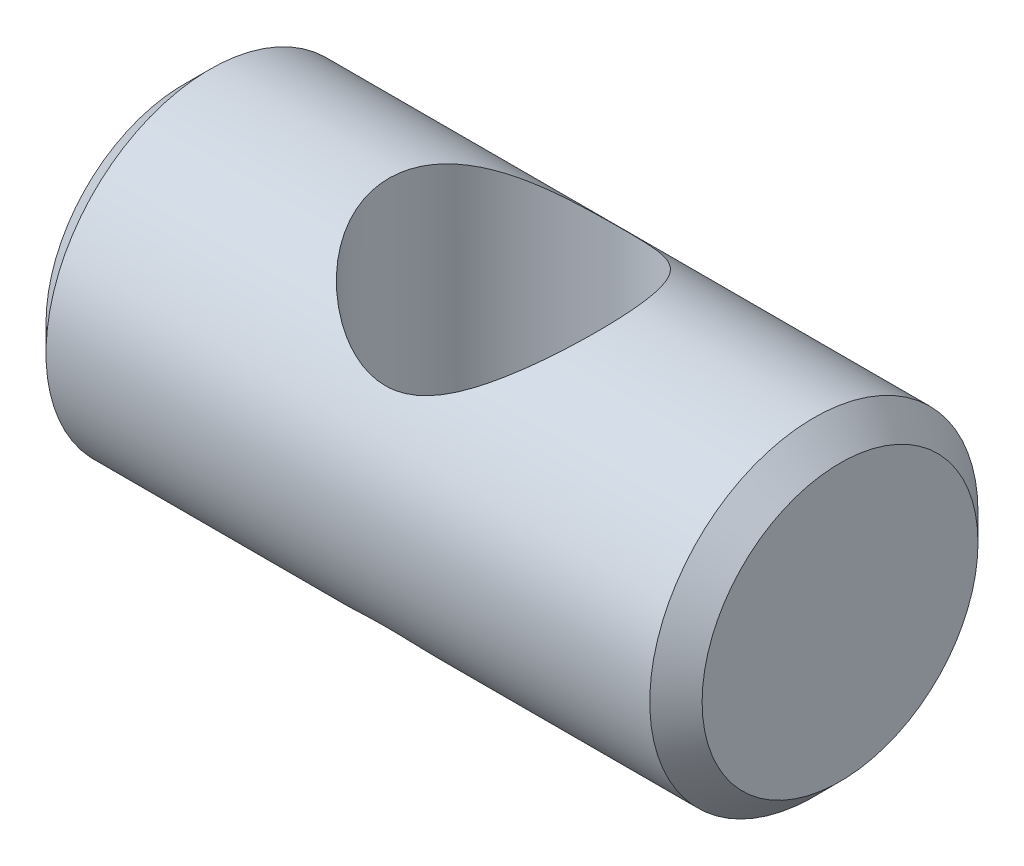
ISO-10303-21;
HEADER;
FILE_DESCRIPTION(('STEP AP214'),'2;1');
FILE_NAME('part.step','',(''),(''),'','','');
FILE_SCHEMA(('AUTOMOTIVE_DESIGN { 1 0 10303 214 1 1 1 1 }'));
ENDSEC;
DATA;
#1=APPLICATION_CONTEXT('core data for automotive mechanical design processes');
#2=APPLICATION_PROTOCOL_DEFINITION('international standard','automotive_design',2000,#1);
#3=PRODUCT_CONTEXT('',#1,'mechanical');
#4=PRODUCT('Part','Part','',(#3));
#5=PRODUCT_RELATED_PRODUCT_CATEGORY('part','',(#4));
#6=PRODUCT_DEFINITION_FORMATION('','',#4);
#7=PRODUCT_DEFINITION_CONTEXT('part definition',#1,'design');
#8=PRODUCT_DEFINITION('design','',#6,#7);
#9=PRODUCT_DEFINITION_SHAPE('','',#8);
#10=(LENGTH_UNIT() NAMED_UNIT(*) SI_UNIT(.MILLI.,.METRE.));
#11=(NAMED_UNIT(*) PLANE_ANGLE_UNIT() SI_UNIT($,.RADIAN.));
#12=(NAMED_UNIT(*) SI_UNIT($,.STERADIAN.) SOLID_ANGLE_UNIT());
#13=UNCERTAINTY_MEASURE_WITH_UNIT(LENGTH_MEASURE(1.E-05),#10,'distance_accuracy_value','');
#14=(GEOMETRIC_REPRESENTATION_CONTEXT(3) GLOBAL_UNCERTAINTY_ASSIGNED_CONTEXT((#13)) GLOBAL_UNIT_ASSIGNED_CONTEXT((#10,
#11,#12)) REPRESENTATION_CONTEXT('',''));
#15=CARTESIAN_POINT('',(0.,0.,0.));
#16=DIRECTION('',(0.,0.,1.));
#17=DIRECTION('',(1.,0.,0.));
#18=AXIS2_PLACEMENT_3D('',#15,#16,#17);
#19=CARTESIAN_POINT('',(9.525,0.,0.));
#20=DIRECTION('',(-1.,0.,0.));
#21=DIRECTION('',(0.,0.,1.));
#22=AXIS2_PLACEMENT_3D('',#19,#20,#21);
#23=CYLINDRICAL_SURFACE('',#22,4.765);
#24=CARTESIAN_POINT('',(0.,-3.0270158572429,3.68));
#25=CARTESIAN_POINT('',(0.0785672773316465,-3.02701614791727,3.67999984364138));
#26=CARTESIAN_POINT('',(0.157136135576355,-3.03031605642996,3.67729277636747));
#27=CARTESIAN_POINT('',(0.313369541449519,-3.04330147157753,3.66655295600809));
#28=CARTESIAN_POINT('',(0.391034010912772,-3.05298752605126,3.65851974601636));
#29=CARTESIAN_POINT('',(0.544942339151606,-3.07820352988238,3.63732812874269));
#30=CARTESIAN_POINT('',(0.621180877977561,-3.09375201630091,3.62415345944192));
#31=CARTESIAN_POINT('',(0.771468880528867,-3.12988210454059,3.59299821855179));
#32=CARTESIAN_POINT('',(0.845516665983407,-3.15046745848851,3.57501406328682));
#33=CARTESIAN_POINT('',(1.09433047382612,-3.22791462831319,3.50587087765695));
#34=CARTESIAN_POINT('',(1.26309282362243,-3.29483865802861,3.44382003292069));
#35=CARTESIAN_POINT('',(1.50370711041474,-3.40467601246938,3.33408533723918));
#36=CARTESIAN_POINT('',(1.58189244838754,-3.44290479326836,3.29468500807197));
#37=CARTESIAN_POINT('',(1.73423285237257,-3.52148653298939,3.21055545325705));
#38=CARTESIAN_POINT('',(1.80838881793449,-3.56183901380659,3.16582742418489));
#39=CARTESIAN_POINT('',(2.02850482582812,-3.68672600847629,3.02153691887044));
#40=CARTESIAN_POINT('',(2.16807869449588,-3.77315168849593,2.9137218740972));
#41=CARTESIAN_POINT('',(2.42959010373284,-3.94426933228633,2.67754924945123));
#42=CARTESIAN_POINT('',(2.55153658554773,-4.02896215617591,2.54920215427041));
#43=CARTESIAN_POINT('',(2.77693730786715,-4.19195052141121,2.27132648174837));
#44=CARTESIAN_POINT('',(2.88023478105728,-4.27018907543985,2.12163570850646));
#45=CARTESIAN_POINT('',(3.06369900830999,-4.41409842691617,1.80316374111448));
#46=CARTESIAN_POINT('',(3.14388622560065,-4.47978032533083,1.63439962117957));
#47=CARTESIAN_POINT('',(3.26635689009236,-4.58439476517905,1.30881127520956));
#48=CARTESIAN_POINT('',(3.3126324755552,-4.62591646772975,1.15433056577145));
#49=CARTESIAN_POINT('',(3.38325654959983,-4.69367027218436,0.837202280830251));
#50=CARTESIAN_POINT('',(3.40762001451853,-4.7199128126465,0.674560363681938));
#51=CARTESIAN_POINT('',(3.43267527752513,-4.75538994748078,0.345016918949482));
#52=CARTESIAN_POINT('',(3.43328564995364,-4.76456593536209,0.178102701594282));
#53=CARTESIAN_POINT('',(3.41018166140548,-4.76540378920208,-0.15408080850447));
#54=CARTESIAN_POINT('',(3.38646547727926,-4.75706434242047,-0.319349977022776));
#55=CARTESIAN_POINT('',(3.31775156953333,-4.72510260499364,-0.634317782486349));
#56=CARTESIAN_POINT('',(3.27397352746067,-4.70233080305011,-0.784375176401481));
#57=CARTESIAN_POINT('',(3.16750864597913,-4.64450941494238,-1.07505429218325));
#58=CARTESIAN_POINT('',(3.10481828431147,-4.60945754152293,-1.21567425043884));
#59=CARTESIAN_POINT('',(2.95652856255593,-4.52638674091888,-1.49677788855974));
#60=CARTESIAN_POINT('',(2.86942133720827,-4.47751111873768,-1.63620711351602));
#61=CARTESIAN_POINT('',(2.67788120319372,-4.37232420780869,-1.89951272145432));
#62=CARTESIAN_POINT('',(2.57343424063936,-4.31600689517522,-2.02337634423389));
#63=CARTESIAN_POINT('',(2.3299298971412,-4.18996971318213,-2.27426780979749));
#64=CARTESIAN_POINT('',(2.18800876851398,-4.11960732735628,-2.39819784816123));
#65=CARTESIAN_POINT('',(1.88505782163775,-3.98107848473248,-2.62174133186739));
#66=CARTESIAN_POINT('',(1.72402241690678,-3.91291267736107,-2.72134764203992));
#67=CARTESIAN_POINT('',(1.40961518716303,-3.79636450990898,-2.881168849186));
#68=CARTESIAN_POINT('',(1.25863725138285,-3.74654731116981,-2.94503209171547));
#69=CARTESIAN_POINT('',(0.945527440392472,-3.66060402226399,-3.05121747931763));
#70=CARTESIAN_POINT('',(0.783414037013449,-3.62445587601066,-3.09357436476774));
#71=CARTESIAN_POINT('',(0.533813056438608,-3.58476149841442,-3.13928376884266));
#72=CARTESIAN_POINT('',(0.449028547115519,-3.57393161480045,-3.15156761613341));
#73=CARTESIAN_POINT('',(0.278275024285706,-3.55780077117142,-3.16976872881678));
#74=CARTESIAN_POINT('',(0.192306660171829,-3.5524968934398,-3.17568935402606));
#75=CARTESIAN_POINT('',(0.0200327709043097,-3.54772147962291,-3.18102355866001));
#76=CARTESIAN_POINT('',(-0.0662726316081498,-3.54824798964232,-3.18043931801256));
#77=CARTESIAN_POINT('',(-0.238338872801631,-3.55508375410915,-3.17279435887041));
#78=CARTESIAN_POINT('',(-0.324099748085629,-3.56139261563451,-3.16573408043507));
#79=CARTESIAN_POINT('',(-0.553401842306179,-3.58576306843395,-3.13816835119393));
#80=CARTESIAN_POINT('',(-0.695739197403447,-3.60894237647337,-3.11173256017326));
#81=CARTESIAN_POINT('',(-0.973480788870414,-3.6678298405413,-3.04208625520151));
#82=CARTESIAN_POINT('',(-1.10887734054379,-3.70355155394913,-2.99885758403296));
#83=CARTESIAN_POINT('',(-1.42379146726815,-3.7997001514418,-2.87675019956371));
#84=CARTESIAN_POINT('',(-1.59919673865542,-3.86428769996493,-2.79052654374781));
#85=CARTESIAN_POINT('',(-1.93113815119942,-4.00059813210694,-2.59133845951309));
#86=CARTESIAN_POINT('',(-2.08764088718698,-4.0723332505011,-2.47832770642991));
#87=CARTESIAN_POINT('',(-2.38199709911894,-4.21579037939226,-2.22570370446708));
#88=CARTESIAN_POINT('',(-2.51955338419097,-4.28749766673045,-2.08573466326166));
#89=CARTESIAN_POINT('',(-2.77028243502779,-4.42234806198233,-1.78201502187867));
#90=CARTESIAN_POINT('',(-2.88349257282064,-4.48550424008068,-1.61830152645774));
#91=CARTESIAN_POINT('',(-3.06402610957439,-4.58658548395503,-1.30045140866569));
#92=CARTESIAN_POINT('',(-3.13591982023922,-4.62699541781642,-1.1497087789086));
#93=CARTESIAN_POINT('',(-3.25766051296821,-4.69370617156705,-0.836599849304388));
#94=CARTESIAN_POINT('',(-3.30752205037566,-4.7200163088041,-0.674241306034805));
#95=CARTESIAN_POINT('',(-3.3829870904449,-4.75572615385405,-0.341241432427479));
#96=CARTESIAN_POINT('',(-3.40846923089666,-4.7650414665297,-0.17056306343874));
#97=CARTESIAN_POINT('',(-3.4334390909829,-4.76495829995348,0.172677006169813));
#98=CARTESIAN_POINT('',(-3.43293306367628,-4.7555643228997,0.345238243758839));
#99=CARTESIAN_POINT('',(-3.40754400048731,-4.71998636563285,0.672126495727843));
#100=CARTESIAN_POINT('',(-3.38468468821344,-4.69525837988108,0.826779473459494));
#101=CARTESIAN_POINT('',(-3.31910619707247,-4.63193340521078,1.12882616508402));
#102=CARTESIAN_POINT('',(-3.27638180384756,-4.59333277548538,1.27621796175838));
#103=CARTESIAN_POINT('',(-3.17042951924722,-4.50215126554465,1.5686260572414));
#104=CARTESIAN_POINT('',(-3.10621371599284,-4.44892473542071,1.71307815224114));
#105=CARTESIAN_POINT('',(-2.96073945861412,-4.33272638873523,1.98874620073682));
#106=CARTESIAN_POINT('',(-2.87947919610231,-4.26975353829207,2.11996074756245));
#107=CARTESIAN_POINT('',(-2.68651050838253,-4.12556821291774,2.39003735747662));
#108=CARTESIAN_POINT('',(-2.57196063848181,-4.04309554925752,2.52618739114483));
#109=CARTESIAN_POINT('',(-2.32447412944916,-3.87408431941462,2.77844859407009));
#110=CARTESIAN_POINT('',(-2.19149095139183,-3.78753584009048,2.89450731580785));
#111=CARTESIAN_POINT('',(-1.96595276183287,-3.65130486353125,3.06263487303052));
#112=CARTESIAN_POINT('',(-1.87886470860019,-3.60090149373494,3.12157066922301));
#113=CARTESIAN_POINT('',(-1.69862262017005,-3.50236607543005,3.23173475735497));
#114=CARTESIAN_POINT('',(-1.60546616441238,-3.45423494663789,3.28295994638551));
#115=CARTESIAN_POINT('',(-1.41335402823623,-3.36225362869259,3.37709887635029));
#116=CARTESIAN_POINT('',(-1.31441341048654,-3.31839304937429,3.4200330530899));
#117=CARTESIAN_POINT('',(-1.11061583662532,-3.23713845030014,3.49704051581634));
#118=CARTESIAN_POINT('',(-1.00576424358736,-3.19973868995705,3.53112168161428));
#119=CARTESIAN_POINT('',(-0.826860618617415,-3.1451674862639,3.57966454279998));
#120=CARTESIAN_POINT('',(-0.754330914941609,-3.12542579098053,3.59686794878708));
#121=CARTESIAN_POINT('',(-0.607204587985831,-3.09080711138969,3.62665947956898));
#122=CARTESIAN_POINT('',(-0.532609008476294,-3.07592771737776,3.63924989089071));
#123=CARTESIAN_POINT('',(-0.382096659839409,-3.05181598122002,3.65949364139542));
#124=CARTESIAN_POINT('',(-0.306185151895192,-3.04256489437812,3.66716337327478));
#125=CARTESIAN_POINT('',(-0.153516252829605,-3.03016475948479,3.67741657137031));
#126=CARTESIAN_POINT('',(-0.0767588809019636,-3.02701557325903,3.68000015275969));
#127=CARTESIAN_POINT('',(0.,-3.0270158572429,3.68));
#128=B_SPLINE_CURVE_WITH_KNOTS('',3,(#24,#25,#26,#27,#28,#29,#30,#31,#32,#33,#34,#35,#36,#37,
#38,#39,#40,#41,#42,#43,#44,#45,#46,#47,#48,#49,#50,#51,#52,#53,#54,#55,#56,#57,#58,#59,#60,#61,
#62,#63,#64,#65,#66,#67,#68,#69,#70,#71,#72,#73,#74,#75,#76,#77,#78,#79,#80,#81,#82,#83,#84,#85,
#86,#87,#88,#89,#90,#91,#92,#93,#94,#95,#96,#97,#98,#99,#100,#101,#102,#103,#104,#105,#106,#107,
#108,#109,#110,#111,#112,#113,#114,#115,#116,#117,#118,#119,#120,#121,#122,#123,#124,#125,#126,
#127),.UNSPECIFIED.,.T.,.F.,(4,2,2,2,2,2,2,2,2,2,2,2,2,2,2,2,2,2,2,2,2,2,2,2,2,2,2,2,2,2,2,2,2,
2,2,2,2,2,2,2,2,2,2,2,2,2,2,2,2,2,2,4),(0.,0.235591708988226,0.471203630963839,
0.707566894291256,0.944106771258297,1.51591397043088,1.80236618274396,2.08875418016066,
2.67592975620557,3.26280644257577,3.85440755326201,4.44548320346413,4.94292664174491,
5.44002983205938,5.93883694376225,6.43768144120932,6.9095606777859,7.38152785217115,
7.89413675044232,8.40716316586386,9.00813916387888,9.60929124216606,10.1214610992978,
10.6328009675269,10.8914987801306,11.1500599316432,11.4085344360666,11.6669913779457,
12.1048085655684,12.5431004643862,13.1573710774192,13.7727118402267,14.3968121302921,
15.0199474601663,15.5333029695888,16.0463188267164,16.5618754223646,17.077307969612,
17.550023970907,18.0228641248864,18.5213957266873,19.0199802486027,19.6062313855034,
20.1939905554461,20.5434646283834,20.8930789631276,21.2418202453876,21.5902500511245,
21.8213124314337,22.0522601254179,22.2824343920731,22.5126034464923),.UNSPECIFIED.);
#129=CARTESIAN_POINT('',(0.,-3.0270158572429,3.68));
#130=VERTEX_POINT('',#129);
#131=EDGE_CURVE('E39',#130,#130,#128,.T.);
#132=ORIENTED_EDGE('',*,*,#131,.T.);
#133=EDGE_LOOP('',(#132));
#134=FACE_BOUND('',#133,.T.);
#135=CARTESIAN_POINT('',(0.,3.02701585724291,3.68));
#136=CARTESIAN_POINT('',(-0.0785672773316467,3.02701614791728,3.67999984364138));
#137=CARTESIAN_POINT('',(-0.157136135576355,3.03031605642997,3.67729277636747));
#138=CARTESIAN_POINT('',(-0.313369541449519,3.04330147157753,3.66655295600809));
#139=CARTESIAN_POINT('',(-0.391034010912772,3.05298752605126,3.65851974601636));
#140=CARTESIAN_POINT('',(-0.544942339151607,3.07820352988238,3.63732812874269));
#141=CARTESIAN_POINT('',(-0.621180877977562,3.09375201630091,3.62415345944192));
#142=CARTESIAN_POINT('',(-0.771468880528867,3.12988210454059,3.59299821855179));
#143=CARTESIAN_POINT('',(-0.845516665983407,3.15046745848851,3.57501406328682));
#144=CARTESIAN_POINT('',(-1.09433047382612,3.22791462831319,3.50587087765695));
#145=CARTESIAN_POINT('',(-1.26309282362243,3.29483865802861,3.44382003292069));
#146=CARTESIAN_POINT('',(-1.50370711041474,3.40467601246938,3.33408533723919));
#147=CARTESIAN_POINT('',(-1.58189244838754,3.44290479326835,3.29468500807198));
#148=CARTESIAN_POINT('',(-1.73423285237257,3.52148653298938,3.21055545325705));
#149=CARTESIAN_POINT('',(-1.80838881793449,3.56183901380659,3.16582742418489));
#150=CARTESIAN_POINT('',(-2.02850482582812,3.68672600847628,3.02153691887044));
#151=CARTESIAN_POINT('',(-2.16807869449588,3.77315168849593,2.9137218740972));
#152=CARTESIAN_POINT('',(-2.42959010373283,3.94426933228633,2.67754924945123));
#153=CARTESIAN_POINT('',(-2.55153658554773,4.0289621561759,2.54920215427041));
#154=CARTESIAN_POINT('',(-2.77693730786715,4.1919505214112,2.27132648174838));
#155=CARTESIAN_POINT('',(-2.88023478105728,4.27018907543985,2.12163570850646));
#156=CARTESIAN_POINT('',(-3.06369900830999,4.41409842691616,1.80316374111448));
#157=CARTESIAN_POINT('',(-3.14388622560065,4.47978032533083,1.63439962117957));
#158=CARTESIAN_POINT('',(-3.26635689009236,4.58439476517905,1.30881127520956));
#159=CARTESIAN_POINT('',(-3.3126324755552,4.62591646772975,1.15433056577145));
#160=CARTESIAN_POINT('',(-3.38325654959983,4.69367027218436,0.837202280830254));
#161=CARTESIAN_POINT('',(-3.40762001451853,4.7199128126465,0.674560363681942));
#162=CARTESIAN_POINT('',(-3.43267527752513,4.75538994748078,0.345016918949486));
#163=CARTESIAN_POINT('',(-3.43328564995364,4.76456593536209,0.178102701594286));
#164=CARTESIAN_POINT('',(-3.41018166140548,4.76540378920208,-0.154080808504467));
#165=CARTESIAN_POINT('',(-3.38646547727926,4.75706434242047,-0.319349977022773));
#166=CARTESIAN_POINT('',(-3.31775156953333,4.72510260499364,-0.634317782486346));
#167=CARTESIAN_POINT('',(-3.27397352746067,4.70233080305011,-0.784375176401478));
#168=CARTESIAN_POINT('',(-3.16750864597913,4.64450941494238,-1.07505429218324));
#169=CARTESIAN_POINT('',(-3.10481828431147,4.60945754152293,-1.21567425043883));
#170=CARTESIAN_POINT('',(-2.95652856255593,4.52638674091888,-1.49677788855974));
#171=CARTESIAN_POINT('',(-2.86942133720827,4.47751111873768,-1.63620711351602));
#172=CARTESIAN_POINT('',(-2.67788120319372,4.37232420780869,-1.89951272145431));
#173=CARTESIAN_POINT('',(-2.57343424063936,4.31600689517522,-2.02337634423388));
#174=CARTESIAN_POINT('',(-2.3299298971412,4.18996971318213,-2.27426780979749));
#175=CARTESIAN_POINT('',(-2.18800876851398,4.11960732735629,-2.39819784816123));
#176=CARTESIAN_POINT('',(-1.88505782163776,3.98107848473248,-2.62174133186739));
#177=CARTESIAN_POINT('',(-1.72402241690679,3.91291267736107,-2.72134764203992));
#178=CARTESIAN_POINT('',(-1.40961518716303,3.79636450990898,-2.881168849186));
#179=CARTESIAN_POINT('',(-1.25863725138286,3.74654731116981,-2.94503209171547));
#180=CARTESIAN_POINT('',(-0.945527440392475,3.66060402226399,-3.05121747931762));
#181=CARTESIAN_POINT('',(-0.783414037013452,3.62445587601066,-3.09357436476774));
#182=CARTESIAN_POINT('',(-0.533813056438612,3.58476149841442,-3.13928376884266));
#183=CARTESIAN_POINT('',(-0.449028547115523,3.57393161480045,-3.15156761613341));
#184=CARTESIAN_POINT('',(-0.27827502428571,3.55780077117141,-3.16976872881678));
#185=CARTESIAN_POINT('',(-0.192306660171833,3.5524968934398,-3.17568935402606));
#186=CARTESIAN_POINT('',(-0.0200327709043139,3.54772147962291,-3.18102355866001));
#187=CARTESIAN_POINT('',(0.0662726316081458,3.54824798964232,-3.18043931801256));
#188=CARTESIAN_POINT('',(0.238338872801627,3.55508375410915,-3.17279435887041));
#189=CARTESIAN_POINT('',(0.324099748085625,3.56139261563451,-3.16573408043508));
#190=CARTESIAN_POINT('',(0.553401842306174,3.58576306843395,-3.13816835119393));
#191=CARTESIAN_POINT('',(0.695739197403441,3.60894237647337,-3.11173256017326));
#192=CARTESIAN_POINT('',(0.973480788870409,3.6678298405413,-3.04208625520151));
#193=CARTESIAN_POINT('',(1.10887734054378,3.70355155394913,-2.99885758403296));
#194=CARTESIAN_POINT('',(1.42379146726814,3.7997001514418,-2.87675019956371));
#195=CARTESIAN_POINT('',(1.59919673865542,3.86428769996493,-2.79052654374781));
#196=CARTESIAN_POINT('',(1.93113815119942,4.00059813210694,-2.59133845951309));
#197=CARTESIAN_POINT('',(2.08764088718698,4.07233325050109,-2.47832770642991));
#198=CARTESIAN_POINT('',(2.38199709911893,4.21579037939226,-2.22570370446708));
#199=CARTESIAN_POINT('',(2.51955338419097,4.28749766673045,-2.08573466326166));
#200=CARTESIAN_POINT('',(2.77028243502779,4.42234806198233,-1.78201502187867));
#201=CARTESIAN_POINT('',(2.88349257282064,4.48550424008068,-1.61830152645774));
#202=CARTESIAN_POINT('',(3.06402610957439,4.58658548395503,-1.30045140866569));
#203=CARTESIAN_POINT('',(3.13591982023922,4.62699541781642,-1.1497087789086));
#204=CARTESIAN_POINT('',(3.25766051296821,4.69370617156705,-0.836599849304389));
#205=CARTESIAN_POINT('',(3.30752205037566,4.7200163088041,-0.674241306034807));
#206=CARTESIAN_POINT('',(3.3829870904449,4.75572615385405,-0.341241432427482));
#207=CARTESIAN_POINT('',(3.40846923089666,4.7650414665297,-0.170563063438744));
#208=CARTESIAN_POINT('',(3.4334390909829,4.76495829995348,0.172677006169809));
#209=CARTESIAN_POINT('',(3.43293306367628,4.7555643228997,0.345238243758836));
#210=CARTESIAN_POINT('',(3.40754400048731,4.71998636563285,0.67212649572784));
#211=CARTESIAN_POINT('',(3.38468468821344,4.69525837988108,0.82677947345949));
#212=CARTESIAN_POINT('',(3.31910619707247,4.63193340521078,1.12882616508402));
#213=CARTESIAN_POINT('',(3.27638180384756,4.59333277548538,1.27621796175838));
#214=CARTESIAN_POINT('',(3.17042951924722,4.50215126554465,1.5686260572414));
#215=CARTESIAN_POINT('',(3.10621371599284,4.44892473542071,1.71307815224114));
#216=CARTESIAN_POINT('',(2.96073945861412,4.33272638873524,1.98874620073681));
#217=CARTESIAN_POINT('',(2.87947919610232,4.26975353829207,2.11996074756245));
#218=CARTESIAN_POINT('',(2.68651050838254,4.12556821291774,2.39003735747662));
#219=CARTESIAN_POINT('',(2.57196063848181,4.04309554925752,2.52618739114483));
#220=CARTESIAN_POINT('',(2.32447412944916,3.87408431941462,2.77844859407009));
#221=CARTESIAN_POINT('',(2.19149095139184,3.78753584009049,2.89450731580785));
#222=CARTESIAN_POINT('',(1.96595276183287,3.65130486353125,3.06263487303052));
#223=CARTESIAN_POINT('',(1.87886470860019,3.60090149373494,3.12157066922301));
#224=CARTESIAN_POINT('',(1.69862262017005,3.50236607543005,3.23173475735497));
#225=CARTESIAN_POINT('',(1.60546616441238,3.4542349466379,3.28295994638551));
#226=CARTESIAN_POINT('',(1.41335402823623,3.36225362869259,3.37709887635029));
#227=CARTESIAN_POINT('',(1.31441341048654,3.31839304937429,3.4200330530899));
#228=CARTESIAN_POINT('',(1.11061583662532,3.23713845030014,3.49704051581634));
#229=CARTESIAN_POINT('',(1.00576424358736,3.19973868995705,3.53112168161428));
#230=CARTESIAN_POINT('',(0.826860618617418,3.1451674862639,3.57966454279998));
#231=CARTESIAN_POINT('',(0.754330914941613,3.12542579098053,3.59686794878708));
#232=CARTESIAN_POINT('',(0.607204587985835,3.09080711138969,3.62665947956898));
#233=CARTESIAN_POINT('',(0.532609008476297,3.07592771737776,3.63924989089071));
#234=CARTESIAN_POINT('',(0.382096659839411,3.05181598122002,3.65949364139542));
#235=CARTESIAN_POINT('',(0.306185151895194,3.04256489437812,3.66716337327478));
#236=CARTESIAN_POINT('',(0.153516252829606,3.03016475948479,3.67741657137031));
#237=CARTESIAN_POINT('',(0.076758880901964,3.02701557325904,3.68000015275969));
#238=CARTESIAN_POINT('',(0.,3.02701585724291,3.68));
#239=B_SPLINE_CURVE_WITH_KNOTS('',3,(#135,#136,#137,#138,#139,#140,#141,#142,#143,#144,#145,
#146,#147,#148,#149,#150,#151,#152,#153,#154,#155,#156,#157,#158,#159,#160,#161,#162,#163,#164,
#165,#166,#167,#168,#169,#170,#171,#172,#173,#174,#175,#176,#177,#178,#179,#180,#181,#182,#183,
#184,#185,#186,#187,#188,#189,#190,#191,#192,#193,#194,#195,#196,#197,#198,#199,#200,#201,#202,
#203,#204,#205,#206,#207,#208,#209,#210,#211,#212,#213,#214,#215,#216,#217,#218,#219,#220,#221,
#222,#223,#224,#225,#226,#227,#228,#229,#230,#231,#232,#233,#234,#235,#236,#237,#238),
.UNSPECIFIED.,.T.,.F.,(4,2,2,2,2,2,2,2,2,2,2,2,2,2,2,2,2,2,2,2,2,2,2,2,2,2,2,2,2,2,2,2,2,2,2,2,
2,2,2,2,2,2,2,2,2,2,2,2,2,2,2,4),(0.,0.235591708988226,0.471203630963839,0.707566894291256,
0.944106771258296,1.51591397043087,1.80236618274396,2.08875418016066,2.67592975620556,
3.26280644257577,3.85440755326201,4.44548320346413,4.94292664174491,5.44002983205938,
5.93883694376225,6.43768144120931,6.9095606777859,7.38152785217115,7.89413675044232,
8.40716316586385,9.00813916387888,9.60929124216606,10.1214610992978,10.6328009675269,
10.8914987801306,11.1500599316432,11.4085344360666,11.6669913779457,12.1048085655684,
12.5431004643861,13.1573710774192,13.7727118402267,14.3968121302921,15.0199474601663,
15.5333029695888,16.0463188267164,16.5618754223646,17.077307969612,17.550023970907,
18.0228641248864,18.5213957266873,19.0199802486027,19.6062313855034,20.1939905554461,
20.5434646283834,20.8930789631276,21.2418202453876,21.5902500511245,21.8213124314337,
22.0522601254179,22.2824343920731,22.5126034464923),.UNSPECIFIED.);
#240=CARTESIAN_POINT('',(0.,3.02701585724291,3.68));
#241=VERTEX_POINT('',#240);
#242=EDGE_CURVE('E56',#241,#241,#239,.T.);
#243=ORIENTED_EDGE('',*,*,#242,.T.);
#244=EDGE_LOOP('',(#243));
#245=FACE_BOUND('',#244,.T.);
#246=CARTESIAN_POINT('',(-8.76499999999999,0.,0.));
#247=DIRECTION('',(1.,0.,0.));
#248=DIRECTION('',(0.,0.,-1.));
#249=AXIS2_PLACEMENT_3D('',#246,#247,#248);
#250=CIRCLE('',#249,4.765);
#251=CARTESIAN_POINT('',(-8.76499999999999,0.,-4.765));
#252=VERTEX_POINT('',#251);
#253=EDGE_CURVE('E53',#252,#252,#250,.T.);
#254=ORIENTED_EDGE('',*,*,#253,.T.);
#255=EDGE_LOOP('',(#254));
#256=FACE_BOUND('',#255,.T.);
#257=CARTESIAN_POINT('',(8.76500000000001,0.,0.));
#258=DIRECTION('',(1.,0.,0.));
#259=DIRECTION('',(0.,0.,-1.));
#260=AXIS2_PLACEMENT_3D('',#257,#258,#259);
#261=CIRCLE('',#260,4.765);
#262=CARTESIAN_POINT('',(8.76500000000001,0.,-4.765));
#263=VERTEX_POINT('',#262);
#264=EDGE_CURVE('E93',#263,#263,#261,.F.);
#265=ORIENTED_EDGE('',*,*,#264,.T.);
#266=EDGE_LOOP('',(#265));
#267=FACE_BOUND('',#266,.T.);
#268=ADVANCED_FACE('F34',(#134,#245,#256,#267),#23,.T.);
#269=CARTESIAN_POINT('',(9.525,0.,0.));
#270=DIRECTION('',(1.,0.,0.));
#271=DIRECTION('',(0.,0.,-1.));
#272=AXIS2_PLACEMENT_3D('',#269,#270,#271);
#273=PLANE('',#272);
#274=CARTESIAN_POINT('',(9.525,0.,0.));
#275=DIRECTION('',(1.,0.,0.));
#276=DIRECTION('',(0.,0.,-1.));
#277=AXIS2_PLACEMENT_3D('',#274,#275,#276);
#278=CIRCLE('',#277,4.00500000000001);
#279=CARTESIAN_POINT('',(9.525,0.,-4.00500000000001));
#280=VERTEX_POINT('',#279);
#281=EDGE_CURVE('E10',#280,#280,#278,.T.);
#282=ORIENTED_EDGE('',*,*,#281,.T.);
#283=EDGE_LOOP('',(#282));
#284=FACE_BOUND('',#283,.T.);
#285=ADVANCED_FACE('F68',(#284),#273,.T.);
#286=CARTESIAN_POINT('',(-9.525,0.,0.));
#287=DIRECTION('',(1.,0.,0.));
#288=DIRECTION('',(0.,0.,-1.));
#289=AXIS2_PLACEMENT_3D('',#286,#287,#288);
#290=PLANE('',#289);
#291=CARTESIAN_POINT('',(-9.525,0.,0.));
#292=DIRECTION('',(1.,0.,0.));
#293=DIRECTION('',(0.,0.,-1.));
#294=AXIS2_PLACEMENT_3D('',#291,#292,#293);
#295=CIRCLE('',#294,4.00499999999998);
#296=CARTESIAN_POINT('',(-9.525,0.,-4.00499999999998));
#297=VERTEX_POINT('',#296);
#298=EDGE_CURVE('E48',#297,#297,#295,.F.);
#299=ORIENTED_EDGE('',*,*,#298,.T.);
#300=EDGE_LOOP('',(#299));
#301=FACE_BOUND('',#300,.T.);
#302=ADVANCED_FACE('F71',(#301),#290,.F.);
#303=CARTESIAN_POINT('',(-8.76499999999999,0.,0.));
#304=DIRECTION('',(1.,0.,0.));
#305=DIRECTION('',(0.,0.,-1.));
#306=AXIS2_PLACEMENT_3D('',#303,#304,#305);
#307=CONICAL_SURFACE('',#306,4.765,0.785398163397451);
#308=ORIENTED_EDGE('',*,*,#298,.F.);
#309=EDGE_LOOP('',(#308));
#310=FACE_BOUND('',#309,.T.);
#311=ORIENTED_EDGE('',*,*,#253,.F.);
#312=EDGE_LOOP('',(#311));
#313=FACE_BOUND('',#312,.T.);
#314=ADVANCED_FACE('F73',(#310,#313),#307,.T.);
#315=CARTESIAN_POINT('',(9.525,0.,0.));
#316=DIRECTION('',(-1.,0.,0.));
#317=DIRECTION('',(0.,0.,1.));
#318=AXIS2_PLACEMENT_3D('',#315,#316,#317);
#319=CONICAL_SURFACE('',#318,4.00500000000001,0.785398163397447);
#320=ORIENTED_EDGE('',*,*,#264,.F.);
#321=EDGE_LOOP('',(#320));
#322=FACE_BOUND('',#321,.T.);
#323=ORIENTED_EDGE('',*,*,#281,.F.);
#324=EDGE_LOOP('',(#323));
#325=FACE_BOUND('',#324,.T.);
#326=ADVANCED_FACE('F37',(#322,#325),#319,.T.);
#327=CARTESIAN_POINT('',(0.,-22.025,0.25));
#328=DIRECTION('',(0.,1.,0.));
#329=DIRECTION('',(0.,0.,1.));
#330=AXIS2_PLACEMENT_3D('',#327,#328,#329);
#331=CYLINDRICAL_SURFACE('',#330,3.43);
#332=ORIENTED_EDGE('',*,*,#242,.F.);
#333=EDGE_LOOP('',(#332));
#334=FACE_BOUND('',#333,.T.);
#335=ORIENTED_EDGE('',*,*,#131,.F.);
#336=EDGE_LOOP('',(#335));
#337=FACE_BOUND('',#336,.T.);
#338=ADVANCED_FACE('F63',(#334,#337),#331,.F.);
#339=CLOSED_SHELL('',(#268,#285,#302,#314,#326,#338));
#340=MANIFOLD_SOLID_BREP('B2',#339);
#341=ADVANCED_BREP_SHAPE_REPRESENTATION('',(#18,#340),#14);
#342=SHAPE_DEFINITION_REPRESENTATION(#9,#341);
ENDSEC;
END-ISO-10303-21;
